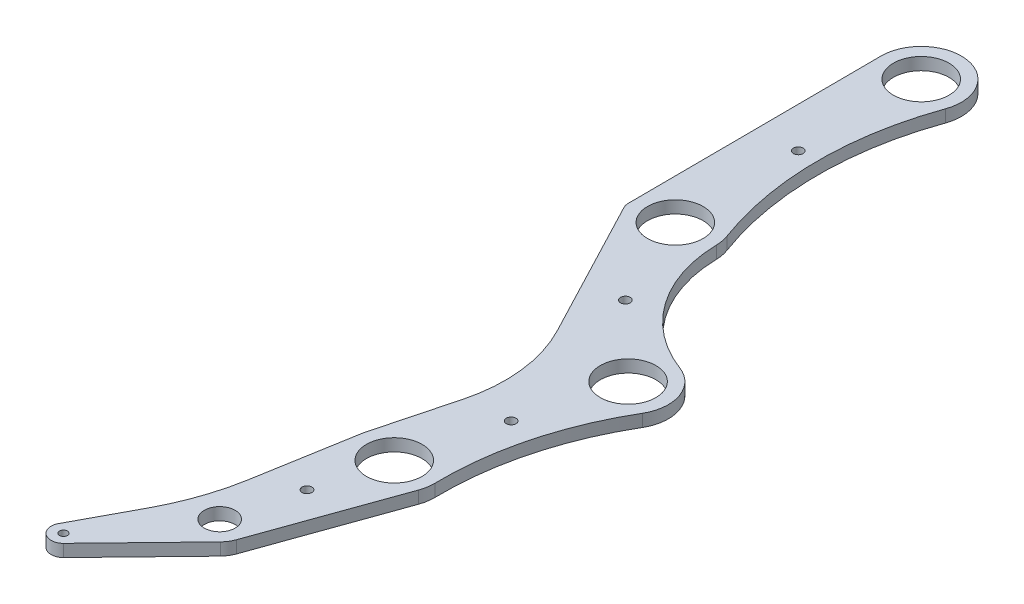
ISO-10303-21;
HEADER;
FILE_DESCRIPTION(('STEP AP214'),'2;1');
FILE_NAME('part.step','',(''),(''),'','','');
FILE_SCHEMA(('AUTOMOTIVE_DESIGN { 1 0 10303 214 1 1 1 1 }'));
ENDSEC;
DATA;
#1=APPLICATION_CONTEXT('core data for automotive mechanical design processes');
#2=APPLICATION_PROTOCOL_DEFINITION('international standard','automotive_design',2000,#1);
#3=PRODUCT_CONTEXT('',#1,'mechanical');
#4=PRODUCT('Part','Part','',(#3));
#5=PRODUCT_RELATED_PRODUCT_CATEGORY('part','',(#4));
#6=PRODUCT_DEFINITION_FORMATION('','',#4);
#7=PRODUCT_DEFINITION_CONTEXT('part definition',#1,'design');
#8=PRODUCT_DEFINITION('design','',#6,#7);
#9=PRODUCT_DEFINITION_SHAPE('','',#8);
#10=(LENGTH_UNIT() NAMED_UNIT(*) SI_UNIT(.MILLI.,.METRE.));
#11=(NAMED_UNIT(*) PLANE_ANGLE_UNIT() SI_UNIT($,.RADIAN.));
#12=(NAMED_UNIT(*) SI_UNIT($,.STERADIAN.) SOLID_ANGLE_UNIT());
#13=UNCERTAINTY_MEASURE_WITH_UNIT(LENGTH_MEASURE(1.E-05),#10,'distance_accuracy_value','');
#14=(GEOMETRIC_REPRESENTATION_CONTEXT(3) GLOBAL_UNCERTAINTY_ASSIGNED_CONTEXT((#13)) GLOBAL_UNIT_ASSIGNED_CONTEXT((#10,
#11,#12)) REPRESENTATION_CONTEXT('',''));
#15=CARTESIAN_POINT('',(0.,0.,0.));
#16=DIRECTION('',(0.,0.,1.));
#17=DIRECTION('',(1.,0.,0.));
#18=AXIS2_PLACEMENT_3D('',#15,#16,#17);
#19=CARTESIAN_POINT('',(-240.289810321256,3.175,-33.8542602698506));
#20=DIRECTION('',(0.,1.,0.));
#21=DIRECTION('',(0.,0.,1.));
#22=AXIS2_PLACEMENT_3D('',#19,#20,#21);
#23=PLANE('',#22);
#24=CARTESIAN_POINT('',(-98.1941762830271,3.175,-189.089496041911));
#25=DIRECTION('',(0.,1.,0.));
#26=DIRECTION('',(0.,0.,1.));
#27=AXIS2_PLACEMENT_3D('',#24,#25,#26);
#28=CIRCLE('',#27,2.48920000000002);
#29=CARTESIAN_POINT('',(-98.1941762830271,3.175,-186.600296041911));
#30=VERTEX_POINT('',#29);
#31=EDGE_CURVE('E363',#30,#30,#28,.T.);
#32=ORIENTED_EDGE('',*,*,#31,.F.);
#33=EDGE_LOOP('',(#32));
#34=FACE_BOUND('',#33,.T.);
#35=CARTESIAN_POINT('',(-95.6018276513845,3.175,-22.8217608302357));
#36=DIRECTION('',(0.,1.,0.));
#37=DIRECTION('',(0.,0.,1.));
#38=AXIS2_PLACEMENT_3D('',#35,#36,#37);
#39=CIRCLE('',#38,2.4892);
#40=CARTESIAN_POINT('',(-95.6018276513845,3.175,-20.3325608302357));
#41=VERTEX_POINT('',#40);
#42=EDGE_CURVE('E351',#41,#41,#39,.T.);
#43=ORIENTED_EDGE('',*,*,#42,.F.);
#44=EDGE_LOOP('',(#43));
#45=FACE_BOUND('',#44,.T.);
#46=CARTESIAN_POINT('',(-138.828241007033,3.175,59.1193454781708));
#47=DIRECTION('',(0.,1.,0.));
#48=DIRECTION('',(0.,0.,1.));
#49=AXIS2_PLACEMENT_3D('',#46,#47,#48);
#50=CIRCLE('',#49,2.02565000000002);
#51=CARTESIAN_POINT('',(-138.828241007033,3.175,61.1449954781708));
#52=VERTEX_POINT('',#51);
#53=EDGE_CURVE('E339',#52,#52,#50,.T.);
#54=ORIENTED_EDGE('',*,*,#53,.F.);
#55=EDGE_LOOP('',(#54));
#56=FACE_BOUND('',#55,.T.);
#57=CARTESIAN_POINT('',(-119.919675793583,3.175,-236.481615970642));
#58=DIRECTION('',(0.,1.,0.));
#59=DIRECTION('',(0.,0.,1.));
#60=AXIS2_PLACEMENT_3D('',#57,#58,#59);
#61=CIRCLE('',#60,14.2874999999999);
#62=CARTESIAN_POINT('',(-119.919675793583,3.175,-222.194115970642));
#63=VERTEX_POINT('',#62);
#64=EDGE_CURVE('E327',#63,#63,#61,.T.);
#65=ORIENTED_EDGE('',*,*,#64,.F.);
#66=EDGE_LOOP('',(#65));
#67=FACE_BOUND('',#66,.T.);
#68=CARTESIAN_POINT('',(-86.2657538413492,3.175,-58.3435216604715));
#69=DIRECTION('',(0.,1.,0.));
#70=DIRECTION('',(0.,0.,1.));
#71=AXIS2_PLACEMENT_3D('',#68,#69,#70);
#72=CIRCLE('',#71,14.2875);
#73=CARTESIAN_POINT('',(-86.2657538413492,3.175,-44.0560216604715));
#74=VERTEX_POINT('',#73);
#75=EDGE_CURVE('E285',#74,#74,#72,.T.);
#76=ORIENTED_EDGE('',*,*,#75,.F.);
#77=EDGE_LOOP('',(#76));
#78=FACE_BOUND('',#77,.T.);
#79=DIRECTION('',(0.00478524944495218,0.,0.999988550628331));
#80=VECTOR('',#79,1.);
#81=CARTESIAN_POINT('',(-141.164666186684,3.175,-363.38140631502));
#82=LINE('',#81,#80);
#83=CARTESIAN_POINT('',(-141.164666186684,3.175,-363.38140631502));
#84=VERTEX_POINT('',#83);
#85=CARTESIAN_POINT('',(-140.540290301718,3.175,-232.903623821849));
#86=VERTEX_POINT('',#85);
#87=EDGE_CURVE('E295',#84,#86,#82,.T.);
#88=ORIENTED_EDGE('',*,*,#87,.T.);
#89=CARTESIAN_POINT('',(-134.190363005228,3.175,-232.934010155824));
#90=DIRECTION('',(0.,1.,0.));
#91=DIRECTION('',(0.,0.,1.));
#92=AXIS2_PLACEMENT_3D('',#89,#90,#91);
#93=CIRCLE('',#92,6.35);
#94=CARTESIAN_POINT('',(-139.81536050136,3.175,-229.987503212253));
#95=VERTEX_POINT('',#94);
#96=EDGE_CURVE('E11',#86,#95,#93,.T.);
#97=ORIENTED_EDGE('',*,*,#96,.T.);
#98=DIRECTION('',(0.46401684150722,0.,0.885826377343587));
#99=VECTOR('',#98,1.);
#100=CARTESIAN_POINT('',(-140.532890654849,3.175,-231.357296460349));
#101=LINE('',#100,#99);
#102=CARTESIAN_POINT('',(-102.030793975978,3.175,-157.85528151108));
#103=VERTEX_POINT('',#102);
#104=EDGE_CURVE('E293',#95,#103,#101,.T.);
#105=ORIENTED_EDGE('',*,*,#104,.T.);
#106=CARTESIAN_POINT('',(-169.53076392956,3.175,-122.49719818823));
#107=DIRECTION('',(0.,-1.,0.));
#108=DIRECTION('',(0.,0.,1.));
#109=AXIS2_PLACEMENT_3D('',#106,#107,#108);
#110=CIRCLE('',#109,76.2);
#111=CARTESIAN_POINT('',(-95.8336839373852,3.175,-103.127624093092));
#112=VERTEX_POINT('',#111);
#113=EDGE_CURVE('E291',#103,#112,#110,.T.);
#114=ORIENTED_EDGE('',*,*,#113,.T.);
#115=DIRECTION('',(-0.254193885762964,0.,0.967153280737198));
#116=VECTOR('',#115,1.);
#117=CARTESIAN_POINT('',(-95.8336839373852,3.175,-103.127624093092));
#118=LINE('',#117,#116);
#119=CARTESIAN_POINT('',(-106.225379672563,3.175,-63.5894479779046));
#120=VERTEX_POINT('',#119);
#121=EDGE_CURVE('E289',#112,#120,#118,.T.);
#122=ORIENTED_EDGE('',*,*,#121,.T.);
#123=CARTESIAN_POINT('',(-86.2657538413492,3.175,-58.3435216604715));
#124=DIRECTION('',(0.,1.,0.));
#125=DIRECTION('',(0.,0.,1.));
#126=AXIS2_PLACEMENT_3D('',#123,#124,#125);
#127=CIRCLE('',#126,20.6375);
#128=CARTESIAN_POINT('',(-106.604150669537,3.175,-61.8443816561251));
#129=VERTEX_POINT('',#128);
#130=EDGE_CURVE('E287',#120,#129,#127,.T.);
#131=ORIENTED_EDGE('',*,*,#130,.T.);
#132=DIRECTION('',(-0.169635856845723,0.,0.985506811783773));
#133=VECTOR('',#132,1.);
#134=CARTESIAN_POINT('',(-106.604150669537,3.175,-61.8443816561251));
#135=LINE('',#134,#133);
#136=CARTESIAN_POINT('',(-115.130445224717,3.175,-12.3105064504438));
#137=VERTEX_POINT('',#136);
#138=EDGE_CURVE('E186',#129,#137,#135,.T.);
#139=ORIENTED_EDGE('',*,*,#138,.T.);
#140=CARTESIAN_POINT('',(-240.289810321256,3.175,-33.8542602698506));
#141=DIRECTION('',(0.,-1.,0.));
#142=DIRECTION('',(0.,0.,1.));
#143=AXIS2_PLACEMENT_3D('',#140,#141,#142);
#144=CIRCLE('',#143,127.);
#145=CARTESIAN_POINT('',(-128.358659431652,3.175,26.1492184670419));
#146=VERTEX_POINT('',#145);
#147=EDGE_CURVE('E181',#137,#146,#144,.T.);
#148=ORIENTED_EDGE('',*,*,#147,.T.);
#149=DIRECTION('',(-0.472468336510965,0.,0.881347644800031));
#150=VECTOR('',#149,1.);
#151=CARTESIAN_POINT('',(-128.358659431652,3.175,26.1492184670419));
#152=LINE('',#151,#150);
#153=CARTESIAN_POINT('',(-144.424798551513,3.175,56.1191715413262));
#154=VERTEX_POINT('',#153);
#155=EDGE_CURVE('E170',#146,#154,#152,.T.);
#156=ORIENTED_EDGE('',*,*,#155,.T.);
#157=CARTESIAN_POINT('',(-138.828241007033,3.175,59.1193454781708));
#158=DIRECTION('',(0.,1.,0.));
#159=DIRECTION('',(0.,0.,1.));
#160=AXIS2_PLACEMENT_3D('',#157,#158,#159);
#161=CIRCLE('',#160,6.35000000000002);
#162=CARTESIAN_POINT('',(-134.265905883713,3.175,63.5360861568301));
#163=VERTEX_POINT('',#162);
#164=EDGE_CURVE('E180',#154,#163,#161,.T.);
#165=ORIENTED_EDGE('',*,*,#164,.T.);
#166=DIRECTION('',(0.695549713174696,0.,-0.718477972176321));
#167=VECTOR('',#166,1.);
#168=CARTESIAN_POINT('',(-134.265905883713,3.175,63.5360861568301));
#169=LINE('',#168,#167);
#170=CARTESIAN_POINT('',(-94.6726474339506,3.175,22.6376665269835));
#171=VERTEX_POINT('',#170);
#172=EDGE_CURVE('E315',#163,#171,#169,.T.);
#173=ORIENTED_EDGE('',*,*,#172,.T.);
#174=CARTESIAN_POINT('',(-104.93790146142,3.175,12.7));
#175=DIRECTION('',(0.,1.,0.));
#176=DIRECTION('',(0.,0.,1.));
#177=AXIS2_PLACEMENT_3D('',#174,#175,#176);
#178=CIRCLE('',#177,14.2875);
#179=CARTESIAN_POINT('',(-91.4853807087424,3.175,17.5127270490632));
#180=VERTEX_POINT('',#179);
#181=EDGE_CURVE('E313',#171,#180,#178,.T.);
#182=ORIENTED_EDGE('',*,*,#181,.T.);
#183=DIRECTION('',(0.336848787336004,0.,-0.941558757842687));
#184=VECTOR('',#183,1.);
#185=CARTESIAN_POINT('',(-91.4853807087424,3.175,17.5127270490632));
#186=LINE('',#185,#184);
#187=CARTESIAN_POINT('',(-66.8343349763708,3.175,-51.3918048118247));
#188=VERTEX_POINT('',#187);
#189=EDGE_CURVE('E311',#180,#188,#186,.T.);
#190=ORIENTED_EDGE('',*,*,#189,.T.);
#191=CARTESIAN_POINT('',(-86.2657538413492,3.175,-58.3435216604715));
#192=DIRECTION('',(0.,1.,0.));
#193=DIRECTION('',(0.,0.,1.));
#194=AXIS2_PLACEMENT_3D('',#191,#192,#193);
#195=CIRCLE('',#194,20.6375);
#196=CARTESIAN_POINT('',(-65.63190809458,3.175,-58.7318719514898));
#197=VERTEX_POINT('',#196);
#198=EDGE_CURVE('E309',#188,#197,#195,.T.);
#199=ORIENTED_EDGE('',*,*,#198,.T.);
#200=CARTESIAN_POINT('',(94.3990569875279,3.175,-61.7438200209033));
#201=DIRECTION('',(0.,-1.,0.));
#202=DIRECTION('',(0.,0.,1.));
#203=AXIS2_PLACEMENT_3D('',#200,#201,#202);
#204=CIRCLE('',#203,160.059306559424);
#205=CARTESIAN_POINT('',(-43.4703149705874,3.175,-143.051986229215));
#206=VERTEX_POINT('',#205);
#207=EDGE_CURVE('E307',#197,#206,#204,.T.);
#208=ORIENTED_EDGE('',*,*,#207,.T.);
#209=CARTESIAN_POINT('',(-61.2467206351295,3.175,-153.53558331703));
#210=DIRECTION('',(0.,1.,0.));
#211=DIRECTION('',(0.,0.,1.));
#212=AXIS2_PLACEMENT_3D('',#209,#210,#211);
#213=CIRCLE('',#212,20.6374999999999);
#214=CARTESIAN_POINT('',(-53.9947234829265,3.175,-172.856943092016));
#215=VERTEX_POINT('',#214);
#216=EDGE_CURVE('E305',#206,#215,#213,.T.);
#217=ORIENTED_EDGE('',*,*,#216,.T.);
#218=CARTESIAN_POINT('',(-29.4495023523931,3.175,-238.252314638122));
#219=DIRECTION('',(0.,-1.,0.));
#220=DIRECTION('',(0.,0.,1.));
#221=AXIS2_PLACEMENT_3D('',#218,#219,#220);
#222=CIRCLE('',#221,69.85);
#223=CARTESIAN_POINT('',(-99.2861274648905,3.175,-236.885459526383));
#224=VERTEX_POINT('',#223);
#225=EDGE_CURVE('E303',#215,#224,#222,.T.);
#226=ORIENTED_EDGE('',*,*,#225,.T.);
#227=CARTESIAN_POINT('',(-119.919675793583,3.175,-236.481615970642));
#228=DIRECTION('',(0.,1.,0.));
#229=DIRECTION('',(0.,0.,1.));
#230=AXIS2_PLACEMENT_3D('',#227,#228,#229);
#231=CIRCLE('',#230,20.6375);
#232=CARTESIAN_POINT('',(-100.559704107501,3.175,-243.629895663274));
#233=VERTEX_POINT('',#232);
#234=EDGE_CURVE('E301',#224,#233,#231,.T.);
#235=ORIENTED_EDGE('',*,*,#234,.T.);
#236=CARTESIAN_POINT('',(54.3200693811581,3.175,-300.816133204327));
#237=DIRECTION('',(0.,-1.,0.));
#238=DIRECTION('',(0.,0.,1.));
#239=AXIS2_PLACEMENT_3D('',#236,#237,#238);
#240=CIRCLE('',#239,165.1);
#241=CARTESIAN_POINT('',(-101.099905600397,3.175,-356.517492045317));
#242=VERTEX_POINT('',#241);
#243=EDGE_CURVE('E299',#233,#242,#240,.T.);
#244=ORIENTED_EDGE('',*,*,#243,.T.);
#245=CARTESIAN_POINT('',(-120.527402473092,3.175,-363.48016190044));
#246=DIRECTION('',(0.,1.,0.));
#247=DIRECTION('',(0.,0.,1.));
#248=AXIS2_PLACEMENT_3D('',#245,#246,#247);
#249=CIRCLE('',#248,20.6375);
#250=EDGE_CURVE('E297',#242,#84,#249,.T.);
#251=ORIENTED_EDGE('',*,*,#250,.T.);
#252=EDGE_LOOP('',(#88,#97,#105,#114,#122,#131,#139,#148,#156,#165,#173,#182,#190,#199,#208,
#217,#226,#235,#244,#251));
#253=FACE_BOUND('',#252,.T.);
#254=CARTESIAN_POINT('',(-61.2467206351295,3.175,-153.53558331703));
#255=DIRECTION('',(0.,1.,0.));
#256=DIRECTION('',(0.,0.,1.));
#257=AXIS2_PLACEMENT_3D('',#254,#255,#256);
#258=CIRCLE('',#257,14.2875);
#259=CARTESIAN_POINT('',(-61.2467206351295,3.175,-139.24808331703));
#260=VERTEX_POINT('',#259);
#261=EDGE_CURVE('E321',#260,#260,#258,.T.);
#262=ORIENTED_EDGE('',*,*,#261,.F.);
#263=EDGE_LOOP('',(#262));
#264=FACE_BOUND('',#263,.T.);
#265=CARTESIAN_POINT('',(-120.527402473092,3.175,-363.48016190044));
#266=DIRECTION('',(0.,1.,0.));
#267=DIRECTION('',(0.,0.,1.));
#268=AXIS2_PLACEMENT_3D('',#265,#266,#267);
#269=CIRCLE('',#268,14.2875);
#270=CARTESIAN_POINT('',(-120.527402473092,3.175,-349.19266190044));
#271=VERTEX_POINT('',#270);
#272=EDGE_CURVE('E333',#271,#271,#269,.T.);
#273=ORIENTED_EDGE('',*,*,#272,.F.);
#274=EDGE_LOOP('',(#273));
#275=FACE_BOUND('',#274,.T.);
#276=CARTESIAN_POINT('',(-104.93790146142,3.175,12.7));
#277=DIRECTION('',(0.,1.,0.));
#278=DIRECTION('',(0.,0.,1.));
#279=AXIS2_PLACEMENT_3D('',#276,#277,#278);
#280=CIRCLE('',#279,7.93749999999999);
#281=CARTESIAN_POINT('',(-104.93790146142,3.175,20.6375));
#282=VERTEX_POINT('',#281);
#283=EDGE_CURVE('E345',#282,#282,#280,.T.);
#284=ORIENTED_EDGE('',*,*,#283,.F.);
#285=EDGE_LOOP('',(#284));
#286=FACE_BOUND('',#285,.T.);
#287=CARTESIAN_POINT('',(-73.7562372382393,3.175,-105.939552488751));
#288=DIRECTION('',(0.,1.,0.));
#289=DIRECTION('',(0.,0.,1.));
#290=AXIS2_PLACEMENT_3D('',#287,#288,#289);
#291=CIRCLE('',#290,2.4892);
#292=CARTESIAN_POINT('',(-73.7562372382393,3.175,-103.450352488751));
#293=VERTEX_POINT('',#292);
#294=EDGE_CURVE('E357',#293,#293,#291,.T.);
#295=ORIENTED_EDGE('',*,*,#294,.F.);
#296=EDGE_LOOP('',(#295));
#297=FACE_BOUND('',#296,.T.);
#298=CARTESIAN_POINT('',(-120.223539133337,3.175,-299.980888935541));
#299=DIRECTION('',(0.,1.,0.));
#300=DIRECTION('',(0.,0.,1.));
#301=AXIS2_PLACEMENT_3D('',#298,#299,#300);
#302=CIRCLE('',#301,2.48920000000001);
#303=CARTESIAN_POINT('',(-120.223539133337,3.175,-297.491688935541));
#304=VERTEX_POINT('',#303);
#305=EDGE_CURVE('E369',#304,#304,#302,.T.);
#306=ORIENTED_EDGE('',*,*,#305,.F.);
#307=EDGE_LOOP('',(#306));
#308=FACE_BOUND('',#307,.T.);
#309=ADVANCED_FACE('F33',(#34,#45,#56,#67,#78,#253,#264,#275,#286,#297,#308),#23,.T.);
#310=CARTESIAN_POINT('',(-240.289810321256,-3.175,-33.8542602698506));
#311=DIRECTION('',(0.,1.,0.));
#312=DIRECTION('',(0.,0.,1.));
#313=AXIS2_PLACEMENT_3D('',#310,#311,#312);
#314=PLANE('',#313);
#315=DIRECTION('',(0.46401684150722,0.,0.885826377343587));
#316=VECTOR('',#315,1.);
#317=CARTESIAN_POINT('',(-140.532890654849,-3.175,-231.357296460349));
#318=LINE('',#317,#316);
#319=CARTESIAN_POINT('',(-139.81536050136,-3.175,-229.987503212253));
#320=VERTEX_POINT('',#319);
#321=CARTESIAN_POINT('',(-102.030793975978,-3.175,-157.85528151108));
#322=VERTEX_POINT('',#321);
#323=EDGE_CURVE('E256',#320,#322,#318,.T.);
#324=ORIENTED_EDGE('',*,*,#323,.F.);
#325=CARTESIAN_POINT('',(-134.190363005228,-3.175,-232.934010155824));
#326=DIRECTION('',(0.,1.,0.));
#327=DIRECTION('',(0.,0.,1.));
#328=AXIS2_PLACEMENT_3D('',#325,#326,#327);
#329=CIRCLE('',#328,6.35);
#330=CARTESIAN_POINT('',(-140.540290301718,-3.175,-232.903623821849));
#331=VERTEX_POINT('',#330);
#332=EDGE_CURVE('E55',#320,#331,#329,.F.);
#333=ORIENTED_EDGE('',*,*,#332,.T.);
#334=DIRECTION('',(0.00478524944495218,0.,0.999988550628331));
#335=VECTOR('',#334,1.);
#336=CARTESIAN_POINT('',(-141.164666186684,-3.175,-363.38140631502));
#337=LINE('',#336,#335);
#338=CARTESIAN_POINT('',(-141.164666186684,-3.175,-363.38140631502));
#339=VERTEX_POINT('',#338);
#340=EDGE_CURVE('E258',#339,#331,#337,.T.);
#341=ORIENTED_EDGE('',*,*,#340,.F.);
#342=CARTESIAN_POINT('',(-120.527402473092,-3.175,-363.48016190044));
#343=DIRECTION('',(0.,1.,0.));
#344=DIRECTION('',(0.,0.,1.));
#345=AXIS2_PLACEMENT_3D('',#342,#343,#344);
#346=CIRCLE('',#345,20.6375);
#347=CARTESIAN_POINT('',(-101.099905600397,-3.175,-356.517492045317));
#348=VERTEX_POINT('',#347);
#349=EDGE_CURVE('E260',#348,#339,#346,.T.);
#350=ORIENTED_EDGE('',*,*,#349,.F.);
#351=CARTESIAN_POINT('',(54.3200693811581,-3.175,-300.816133204327));
#352=DIRECTION('',(0.,-1.,0.));
#353=DIRECTION('',(0.,0.,1.));
#354=AXIS2_PLACEMENT_3D('',#351,#352,#353);
#355=CIRCLE('',#354,165.1);
#356=CARTESIAN_POINT('',(-100.559704107501,-3.175,-243.629895663274));
#357=VERTEX_POINT('',#356);
#358=EDGE_CURVE('E262',#357,#348,#355,.T.);
#359=ORIENTED_EDGE('',*,*,#358,.F.);
#360=CARTESIAN_POINT('',(-119.919675793583,-3.175,-236.481615970642));
#361=DIRECTION('',(0.,1.,0.));
#362=DIRECTION('',(0.,0.,1.));
#363=AXIS2_PLACEMENT_3D('',#360,#361,#362);
#364=CIRCLE('',#363,20.6375);
#365=CARTESIAN_POINT('',(-99.2861274648905,-3.175,-236.885459526383));
#366=VERTEX_POINT('',#365);
#367=EDGE_CURVE('E264',#366,#357,#364,.T.);
#368=ORIENTED_EDGE('',*,*,#367,.F.);
#369=CARTESIAN_POINT('',(-29.4495023523931,-3.175,-238.252314638122));
#370=DIRECTION('',(0.,-1.,0.));
#371=DIRECTION('',(0.,0.,1.));
#372=AXIS2_PLACEMENT_3D('',#369,#370,#371);
#373=CIRCLE('',#372,69.85);
#374=CARTESIAN_POINT('',(-53.9947234829265,-3.175,-172.856943092016));
#375=VERTEX_POINT('',#374);
#376=EDGE_CURVE('E266',#375,#366,#373,.T.);
#377=ORIENTED_EDGE('',*,*,#376,.F.);
#378=CARTESIAN_POINT('',(-61.2467206351295,-3.175,-153.53558331703));
#379=DIRECTION('',(0.,1.,0.));
#380=DIRECTION('',(0.,0.,1.));
#381=AXIS2_PLACEMENT_3D('',#378,#379,#380);
#382=CIRCLE('',#381,20.6374999999999);
#383=CARTESIAN_POINT('',(-43.4703149705874,-3.175,-143.051986229215));
#384=VERTEX_POINT('',#383);
#385=EDGE_CURVE('E268',#384,#375,#382,.T.);
#386=ORIENTED_EDGE('',*,*,#385,.F.);
#387=CARTESIAN_POINT('',(94.3990569875279,-3.175,-61.7438200209033));
#388=DIRECTION('',(0.,-1.,0.));
#389=DIRECTION('',(0.,0.,1.));
#390=AXIS2_PLACEMENT_3D('',#387,#388,#389);
#391=CIRCLE('',#390,160.059306559424);
#392=CARTESIAN_POINT('',(-65.63190809458,-3.175,-58.7318719514898));
#393=VERTEX_POINT('',#392);
#394=EDGE_CURVE('E270',#393,#384,#391,.T.);
#395=ORIENTED_EDGE('',*,*,#394,.F.);
#396=CARTESIAN_POINT('',(-86.2657538413492,-3.175,-58.3435216604715));
#397=DIRECTION('',(0.,1.,0.));
#398=DIRECTION('',(0.,0.,1.));
#399=AXIS2_PLACEMENT_3D('',#396,#397,#398);
#400=CIRCLE('',#399,20.6375);
#401=CARTESIAN_POINT('',(-66.8343349763708,-3.175,-51.3918048118247));
#402=VERTEX_POINT('',#401);
#403=EDGE_CURVE('E272',#402,#393,#400,.T.);
#404=ORIENTED_EDGE('',*,*,#403,.F.);
#405=DIRECTION('',(0.336848787336004,0.,-0.941558757842687));
#406=VECTOR('',#405,1.);
#407=CARTESIAN_POINT('',(-91.4853807087424,-3.175,17.5127270490632));
#408=LINE('',#407,#406);
#409=CARTESIAN_POINT('',(-91.4853807087424,-3.175,17.5127270490632));
#410=VERTEX_POINT('',#409);
#411=EDGE_CURVE('E274',#410,#402,#408,.T.);
#412=ORIENTED_EDGE('',*,*,#411,.F.);
#413=CARTESIAN_POINT('',(-104.93790146142,-3.175,12.7));
#414=DIRECTION('',(0.,1.,0.));
#415=DIRECTION('',(0.,0.,1.));
#416=AXIS2_PLACEMENT_3D('',#413,#414,#415);
#417=CIRCLE('',#416,14.2875);
#418=CARTESIAN_POINT('',(-94.6726474339506,-3.175,22.6376665269835));
#419=VERTEX_POINT('',#418);
#420=EDGE_CURVE('E276',#419,#410,#417,.T.);
#421=ORIENTED_EDGE('',*,*,#420,.F.);
#422=DIRECTION('',(0.695549713174696,0.,-0.718477972176321));
#423=VECTOR('',#422,1.);
#424=CARTESIAN_POINT('',(-134.265905883713,-3.175,63.5360861568301));
#425=LINE('',#424,#423);
#426=CARTESIAN_POINT('',(-134.265905883713,-3.175,63.5360861568301));
#427=VERTEX_POINT('',#426);
#428=EDGE_CURVE('E278',#427,#419,#425,.T.);
#429=ORIENTED_EDGE('',*,*,#428,.F.);
#430=CARTESIAN_POINT('',(-138.828241007033,-3.175,59.1193454781708));
#431=DIRECTION('',(0.,1.,0.));
#432=DIRECTION('',(0.,0.,1.));
#433=AXIS2_PLACEMENT_3D('',#430,#431,#432);
#434=CIRCLE('',#433,6.35000000000002);
#435=CARTESIAN_POINT('',(-144.424798551513,-3.175,56.1191715413262));
#436=VERTEX_POINT('',#435);
#437=EDGE_CURVE('E280',#436,#427,#434,.T.);
#438=ORIENTED_EDGE('',*,*,#437,.F.);
#439=DIRECTION('',(-0.472468336510965,0.,0.881347644800031));
#440=VECTOR('',#439,1.);
#441=CARTESIAN_POINT('',(-128.358659431652,-3.175,26.1492184670419));
#442=LINE('',#441,#440);
#443=CARTESIAN_POINT('',(-128.358659431652,-3.175,26.1492184670419));
#444=VERTEX_POINT('',#443);
#445=EDGE_CURVE('E282',#444,#436,#442,.T.);
#446=ORIENTED_EDGE('',*,*,#445,.F.);
#447=CARTESIAN_POINT('',(-240.289810321256,-3.175,-33.8542602698506));
#448=DIRECTION('',(0.,-1.,0.));
#449=DIRECTION('',(0.,0.,1.));
#450=AXIS2_PLACEMENT_3D('',#447,#448,#449);
#451=CIRCLE('',#450,127.);
#452=CARTESIAN_POINT('',(-115.130445224717,-3.175,-12.3105064504438));
#453=VERTEX_POINT('',#452);
#454=EDGE_CURVE('E194',#453,#444,#451,.T.);
#455=ORIENTED_EDGE('',*,*,#454,.F.);
#456=DIRECTION('',(-0.169635856845723,0.,0.985506811783773));
#457=VECTOR('',#456,1.);
#458=CARTESIAN_POINT('',(-106.604150669537,-3.175,-61.8443816561251));
#459=LINE('',#458,#457);
#460=CARTESIAN_POINT('',(-106.604150669537,-3.175,-61.8443816561251));
#461=VERTEX_POINT('',#460);
#462=EDGE_CURVE('E190',#461,#453,#459,.T.);
#463=ORIENTED_EDGE('',*,*,#462,.F.);
#464=CARTESIAN_POINT('',(-86.2657538413492,-3.175,-58.3435216604715));
#465=DIRECTION('',(0.,1.,0.));
#466=DIRECTION('',(0.,0.,1.));
#467=AXIS2_PLACEMENT_3D('',#464,#465,#466);
#468=CIRCLE('',#467,20.6375);
#469=CARTESIAN_POINT('',(-106.225379672563,-3.175,-63.5894479779046));
#470=VERTEX_POINT('',#469);
#471=EDGE_CURVE('E250',#470,#461,#468,.T.);
#472=ORIENTED_EDGE('',*,*,#471,.F.);
#473=DIRECTION('',(-0.254193885762964,0.,0.967153280737198));
#474=VECTOR('',#473,1.);
#475=CARTESIAN_POINT('',(-95.8336839373852,-3.175,-103.127624093092));
#476=LINE('',#475,#474);
#477=CARTESIAN_POINT('',(-95.8336839373852,-3.175,-103.127624093092));
#478=VERTEX_POINT('',#477);
#479=EDGE_CURVE('E252',#478,#470,#476,.T.);
#480=ORIENTED_EDGE('',*,*,#479,.F.);
#481=CARTESIAN_POINT('',(-169.53076392956,-3.175,-122.49719818823));
#482=DIRECTION('',(0.,-1.,0.));
#483=DIRECTION('',(0.,0.,1.));
#484=AXIS2_PLACEMENT_3D('',#481,#482,#483);
#485=CIRCLE('',#484,76.2);
#486=EDGE_CURVE('E254',#322,#478,#485,.T.);
#487=ORIENTED_EDGE('',*,*,#486,.F.);
#488=EDGE_LOOP('',(#324,#333,#341,#350,#359,#368,#377,#386,#395,#404,#412,#421,#429,#438,#446,
#455,#463,#472,#480,#487));
#489=FACE_BOUND('',#488,.T.);
#490=CARTESIAN_POINT('',(-86.2657538413492,-3.175,-58.3435216604715));
#491=DIRECTION('',(0.,1.,0.));
#492=DIRECTION('',(0.,0.,1.));
#493=AXIS2_PLACEMENT_3D('',#490,#491,#492);
#494=CIRCLE('',#493,14.2875);
#495=CARTESIAN_POINT('',(-86.2657538413492,-3.175,-44.0560216604715));
#496=VERTEX_POINT('',#495);
#497=EDGE_CURVE('E318',#496,#496,#494,.T.);
#498=ORIENTED_EDGE('',*,*,#497,.T.);
#499=EDGE_LOOP('',(#498));
#500=FACE_BOUND('',#499,.T.);
#501=CARTESIAN_POINT('',(-61.2467206351295,-3.175,-153.53558331703));
#502=DIRECTION('',(0.,1.,0.));
#503=DIRECTION('',(0.,0.,1.));
#504=AXIS2_PLACEMENT_3D('',#501,#502,#503);
#505=CIRCLE('',#504,14.2875);
#506=CARTESIAN_POINT('',(-61.2467206351295,-3.175,-139.24808331703));
#507=VERTEX_POINT('',#506);
#508=EDGE_CURVE('E324',#507,#507,#505,.T.);
#509=ORIENTED_EDGE('',*,*,#508,.T.);
#510=EDGE_LOOP('',(#509));
#511=FACE_BOUND('',#510,.T.);
#512=CARTESIAN_POINT('',(-119.919675793583,-3.175,-236.481615970642));
#513=DIRECTION('',(0.,1.,0.));
#514=DIRECTION('',(0.,0.,1.));
#515=AXIS2_PLACEMENT_3D('',#512,#513,#514);
#516=CIRCLE('',#515,14.2874999999999);
#517=CARTESIAN_POINT('',(-119.919675793583,-3.175,-222.194115970642));
#518=VERTEX_POINT('',#517);
#519=EDGE_CURVE('E330',#518,#518,#516,.T.);
#520=ORIENTED_EDGE('',*,*,#519,.T.);
#521=EDGE_LOOP('',(#520));
#522=FACE_BOUND('',#521,.T.);
#523=CARTESIAN_POINT('',(-120.527402473092,-3.175,-363.48016190044));
#524=DIRECTION('',(0.,1.,0.));
#525=DIRECTION('',(0.,0.,1.));
#526=AXIS2_PLACEMENT_3D('',#523,#524,#525);
#527=CIRCLE('',#526,14.2875);
#528=CARTESIAN_POINT('',(-120.527402473092,-3.175,-349.19266190044));
#529=VERTEX_POINT('',#528);
#530=EDGE_CURVE('E336',#529,#529,#527,.T.);
#531=ORIENTED_EDGE('',*,*,#530,.T.);
#532=EDGE_LOOP('',(#531));
#533=FACE_BOUND('',#532,.T.);
#534=CARTESIAN_POINT('',(-138.828241007033,-3.175,59.1193454781708));
#535=DIRECTION('',(0.,1.,0.));
#536=DIRECTION('',(0.,0.,1.));
#537=AXIS2_PLACEMENT_3D('',#534,#535,#536);
#538=CIRCLE('',#537,2.02565000000002);
#539=CARTESIAN_POINT('',(-138.828241007033,-3.175,61.1449954781708));
#540=VERTEX_POINT('',#539);
#541=EDGE_CURVE('E342',#540,#540,#538,.T.);
#542=ORIENTED_EDGE('',*,*,#541,.T.);
#543=EDGE_LOOP('',(#542));
#544=FACE_BOUND('',#543,.T.);
#545=CARTESIAN_POINT('',(-104.93790146142,-3.175,12.7));
#546=DIRECTION('',(0.,1.,0.));
#547=DIRECTION('',(0.,0.,1.));
#548=AXIS2_PLACEMENT_3D('',#545,#546,#547);
#549=CIRCLE('',#548,7.93749999999999);
#550=CARTESIAN_POINT('',(-104.93790146142,-3.175,20.6375));
#551=VERTEX_POINT('',#550);
#552=EDGE_CURVE('E348',#551,#551,#549,.T.);
#553=ORIENTED_EDGE('',*,*,#552,.T.);
#554=EDGE_LOOP('',(#553));
#555=FACE_BOUND('',#554,.T.);
#556=CARTESIAN_POINT('',(-95.6018276513845,-3.175,-22.8217608302357));
#557=DIRECTION('',(0.,1.,0.));
#558=DIRECTION('',(0.,0.,1.));
#559=AXIS2_PLACEMENT_3D('',#556,#557,#558);
#560=CIRCLE('',#559,2.4892);
#561=CARTESIAN_POINT('',(-95.6018276513845,-3.175,-20.3325608302357));
#562=VERTEX_POINT('',#561);
#563=EDGE_CURVE('E354',#562,#562,#560,.T.);
#564=ORIENTED_EDGE('',*,*,#563,.T.);
#565=EDGE_LOOP('',(#564));
#566=FACE_BOUND('',#565,.T.);
#567=CARTESIAN_POINT('',(-73.7562372382393,-3.175,-105.939552488751));
#568=DIRECTION('',(0.,1.,0.));
#569=DIRECTION('',(0.,0.,1.));
#570=AXIS2_PLACEMENT_3D('',#567,#568,#569);
#571=CIRCLE('',#570,2.4892);
#572=CARTESIAN_POINT('',(-73.7562372382393,-3.175,-103.450352488751));
#573=VERTEX_POINT('',#572);
#574=EDGE_CURVE('E360',#573,#573,#571,.T.);
#575=ORIENTED_EDGE('',*,*,#574,.T.);
#576=EDGE_LOOP('',(#575));
#577=FACE_BOUND('',#576,.T.);
#578=CARTESIAN_POINT('',(-98.1941762830271,-3.175,-189.089496041911));
#579=DIRECTION('',(0.,1.,0.));
#580=DIRECTION('',(0.,0.,1.));
#581=AXIS2_PLACEMENT_3D('',#578,#579,#580);
#582=CIRCLE('',#581,2.48920000000002);
#583=CARTESIAN_POINT('',(-98.1941762830271,-3.175,-186.600296041911));
#584=VERTEX_POINT('',#583);
#585=EDGE_CURVE('E366',#584,#584,#582,.T.);
#586=ORIENTED_EDGE('',*,*,#585,.T.);
#587=EDGE_LOOP('',(#586));
#588=FACE_BOUND('',#587,.T.);
#589=CARTESIAN_POINT('',(-120.223539133337,-3.175,-299.980888935541));
#590=DIRECTION('',(0.,1.,0.));
#591=DIRECTION('',(0.,0.,1.));
#592=AXIS2_PLACEMENT_3D('',#589,#590,#591);
#593=CIRCLE('',#592,2.48920000000001);
#594=CARTESIAN_POINT('',(-120.223539133337,-3.175,-297.491688935541));
#595=VERTEX_POINT('',#594);
#596=EDGE_CURVE('E372',#595,#595,#593,.T.);
#597=ORIENTED_EDGE('',*,*,#596,.T.);
#598=EDGE_LOOP('',(#597));
#599=FACE_BOUND('',#598,.T.);
#600=ADVANCED_FACE('F382',(#489,#500,#511,#522,#533,#544,#555,#566,#577,#588,#599),#314,.F.);
#601=CARTESIAN_POINT('',(-240.289810321256,3.175,-33.8542602698506));
#602=DIRECTION('',(0.,-1.,0.));
#603=DIRECTION('',(0.,0.,-1.));
#604=AXIS2_PLACEMENT_3D('',#601,#602,#603);
#605=CYLINDRICAL_SURFACE('',#604,127.);
#606=ORIENTED_EDGE('',*,*,#454,.T.);
#607=DIRECTION('',(0.,-1.,0.));
#608=VECTOR('',#607,1.);
#609=CARTESIAN_POINT('',(-128.358659431652,3.175,26.1492184670419));
#610=LINE('',#609,#608);
#611=EDGE_CURVE('E174',#146,#444,#610,.T.);
#612=ORIENTED_EDGE('',*,*,#611,.F.);
#613=ORIENTED_EDGE('',*,*,#147,.F.);
#614=DIRECTION('',(0.,-1.,0.));
#615=VECTOR('',#614,1.);
#616=CARTESIAN_POINT('',(-115.130445224717,3.175,-12.3105064504438));
#617=LINE('',#616,#615);
#618=EDGE_CURVE('E247',#137,#453,#617,.T.);
#619=ORIENTED_EDGE('',*,*,#618,.T.);
#620=EDGE_LOOP('',(#606,#612,#613,#619));
#621=FACE_BOUND('',#620,.T.);
#622=ADVANCED_FACE('F192',(#621),#605,.F.);
#623=CARTESIAN_POINT('',(-128.358659431652,3.175,26.1492184670419));
#624=DIRECTION('',(0.881347644800031,0.,0.472468336510965));
#625=DIRECTION('',(0.472468336510965,0.,-0.881347644800031));
#626=AXIS2_PLACEMENT_3D('',#623,#624,#625);
#627=PLANE('',#626);
#628=ORIENTED_EDGE('',*,*,#445,.T.);
#629=DIRECTION('',(0.,-1.,0.));
#630=VECTOR('',#629,1.);
#631=CARTESIAN_POINT('',(-144.424798551513,3.175,56.1191715413262));
#632=LINE('',#631,#630);
#633=EDGE_CURVE('E177',#154,#436,#632,.T.);
#634=ORIENTED_EDGE('',*,*,#633,.F.);
#635=ORIENTED_EDGE('',*,*,#155,.F.);
#636=ORIENTED_EDGE('',*,*,#611,.T.);
#637=EDGE_LOOP('',(#628,#634,#635,#636));
#638=FACE_BOUND('',#637,.T.);
#639=ADVANCED_FACE('F172',(#638),#627,.F.);
#640=CARTESIAN_POINT('',(-138.828241007033,3.175,59.1193454781708));
#641=DIRECTION('',(0.,-1.,0.));
#642=DIRECTION('',(0.,0.,-1.));
#643=AXIS2_PLACEMENT_3D('',#640,#641,#642);
#644=CYLINDRICAL_SURFACE('',#643,6.35000000000002);
#645=ORIENTED_EDGE('',*,*,#437,.T.);
#646=DIRECTION('',(0.,-1.,0.));
#647=VECTOR('',#646,1.);
#648=CARTESIAN_POINT('',(-134.265905883713,3.175,63.5360861568301));
#649=LINE('',#648,#647);
#650=EDGE_CURVE('E199',#163,#427,#649,.T.);
#651=ORIENTED_EDGE('',*,*,#650,.F.);
#652=ORIENTED_EDGE('',*,*,#164,.F.);
#653=ORIENTED_EDGE('',*,*,#633,.T.);
#654=EDGE_LOOP('',(#645,#651,#652,#653));
#655=FACE_BOUND('',#654,.T.);
#656=ADVANCED_FACE('F457',(#655),#644,.T.);
#657=CARTESIAN_POINT('',(-134.265905883713,3.175,63.5360861568301));
#658=DIRECTION('',(-0.718477972176321,0.,-0.695549713174696));
#659=DIRECTION('',(-0.695549713174696,0.,0.718477972176321));
#660=AXIS2_PLACEMENT_3D('',#657,#658,#659);
#661=PLANE('',#660);
#662=ORIENTED_EDGE('',*,*,#428,.T.);
#663=DIRECTION('',(0.,-1.,0.));
#664=VECTOR('',#663,1.);
#665=CARTESIAN_POINT('',(-94.6726474339506,3.175,22.6376665269835));
#666=LINE('',#665,#664);
#667=EDGE_CURVE('E205',#171,#419,#666,.T.);
#668=ORIENTED_EDGE('',*,*,#667,.F.);
#669=ORIENTED_EDGE('',*,*,#172,.F.);
#670=ORIENTED_EDGE('',*,*,#650,.T.);
#671=EDGE_LOOP('',(#662,#668,#669,#670));
#672=FACE_BOUND('',#671,.T.);
#673=ADVANCED_FACE('F453',(#672),#661,.F.);
#674=CARTESIAN_POINT('',(-104.93790146142,3.175,12.7));
#675=DIRECTION('',(0.,-1.,0.));
#676=DIRECTION('',(0.,0.,-1.));
#677=AXIS2_PLACEMENT_3D('',#674,#675,#676);
#678=CYLINDRICAL_SURFACE('',#677,14.2875);
#679=ORIENTED_EDGE('',*,*,#420,.T.);
#680=DIRECTION('',(0.,-1.,0.));
#681=VECTOR('',#680,1.);
#682=CARTESIAN_POINT('',(-91.4853807087424,3.175,17.5127270490632));
#683=LINE('',#682,#681);
#684=EDGE_CURVE('E208',#180,#410,#683,.T.);
#685=ORIENTED_EDGE('',*,*,#684,.F.);
#686=ORIENTED_EDGE('',*,*,#181,.F.);
#687=ORIENTED_EDGE('',*,*,#667,.T.);
#688=EDGE_LOOP('',(#679,#685,#686,#687));
#689=FACE_BOUND('',#688,.T.);
#690=ADVANCED_FACE('F449',(#689),#678,.T.);
#691=CARTESIAN_POINT('',(-91.4853807087424,3.175,17.5127270490632));
#692=DIRECTION('',(-0.941558757842687,0.,-0.336848787336004));
#693=DIRECTION('',(-0.336848787336004,0.,0.941558757842687));
#694=AXIS2_PLACEMENT_3D('',#691,#692,#693);
#695=PLANE('',#694);
#696=ORIENTED_EDGE('',*,*,#411,.T.);
#697=DIRECTION('',(0.,-1.,0.));
#698=VECTOR('',#697,1.);
#699=CARTESIAN_POINT('',(-66.8343349763708,3.175,-51.3918048118247));
#700=LINE('',#699,#698);
#701=EDGE_CURVE('E211',#188,#402,#700,.T.);
#702=ORIENTED_EDGE('',*,*,#701,.F.);
#703=ORIENTED_EDGE('',*,*,#189,.F.);
#704=ORIENTED_EDGE('',*,*,#684,.T.);
#705=EDGE_LOOP('',(#696,#702,#703,#704));
#706=FACE_BOUND('',#705,.T.);
#707=ADVANCED_FACE('F445',(#706),#695,.F.);
#708=CARTESIAN_POINT('',(-86.2657538413492,3.175,-58.3435216604715));
#709=DIRECTION('',(0.,-1.,0.));
#710=DIRECTION('',(0.,0.,-1.));
#711=AXIS2_PLACEMENT_3D('',#708,#709,#710);
#712=CYLINDRICAL_SURFACE('',#711,20.6375);
#713=ORIENTED_EDGE('',*,*,#403,.T.);
#714=DIRECTION('',(0.,-1.,0.));
#715=VECTOR('',#714,1.);
#716=CARTESIAN_POINT('',(-65.63190809458,3.175,-58.7318719514898));
#717=LINE('',#716,#715);
#718=EDGE_CURVE('E214',#197,#393,#717,.T.);
#719=ORIENTED_EDGE('',*,*,#718,.F.);
#720=ORIENTED_EDGE('',*,*,#198,.F.);
#721=ORIENTED_EDGE('',*,*,#701,.T.);
#722=EDGE_LOOP('',(#713,#719,#720,#721));
#723=FACE_BOUND('',#722,.T.);
#724=ADVANCED_FACE('F441',(#723),#712,.T.);
#725=CARTESIAN_POINT('',(94.3990569875279,3.175,-61.7438200209033));
#726=DIRECTION('',(0.,-1.,0.));
#727=DIRECTION('',(0.,0.,-1.));
#728=AXIS2_PLACEMENT_3D('',#725,#726,#727);
#729=CYLINDRICAL_SURFACE('',#728,160.059306559424);
#730=ORIENTED_EDGE('',*,*,#394,.T.);
#731=DIRECTION('',(0.,-1.,0.));
#732=VECTOR('',#731,1.);
#733=CARTESIAN_POINT('',(-43.4703149705874,3.175,-143.051986229215));
#734=LINE('',#733,#732);
#735=EDGE_CURVE('E217',#206,#384,#734,.T.);
#736=ORIENTED_EDGE('',*,*,#735,.F.);
#737=ORIENTED_EDGE('',*,*,#207,.F.);
#738=ORIENTED_EDGE('',*,*,#718,.T.);
#739=EDGE_LOOP('',(#730,#736,#737,#738));
#740=FACE_BOUND('',#739,.T.);
#741=ADVANCED_FACE('F437',(#740),#729,.F.);
#742=CARTESIAN_POINT('',(-61.2467206351295,3.175,-153.53558331703));
#743=DIRECTION('',(0.,-1.,0.));
#744=DIRECTION('',(0.,0.,-1.));
#745=AXIS2_PLACEMENT_3D('',#742,#743,#744);
#746=CYLINDRICAL_SURFACE('',#745,20.6374999999999);
#747=ORIENTED_EDGE('',*,*,#385,.T.);
#748=DIRECTION('',(0.,-1.,0.));
#749=VECTOR('',#748,1.);
#750=CARTESIAN_POINT('',(-53.9947234829265,3.175,-172.856943092016));
#751=LINE('',#750,#749);
#752=EDGE_CURVE('E220',#215,#375,#751,.T.);
#753=ORIENTED_EDGE('',*,*,#752,.F.);
#754=ORIENTED_EDGE('',*,*,#216,.F.);
#755=ORIENTED_EDGE('',*,*,#735,.T.);
#756=EDGE_LOOP('',(#747,#753,#754,#755));
#757=FACE_BOUND('',#756,.T.);
#758=ADVANCED_FACE('F433',(#757),#746,.T.);
#759=CARTESIAN_POINT('',(-29.4495023523931,3.175,-238.252314638122));
#760=DIRECTION('',(0.,-1.,0.));
#761=DIRECTION('',(0.,0.,-1.));
#762=AXIS2_PLACEMENT_3D('',#759,#760,#761);
#763=CYLINDRICAL_SURFACE('',#762,69.85);
#764=ORIENTED_EDGE('',*,*,#376,.T.);
#765=DIRECTION('',(0.,-1.,0.));
#766=VECTOR('',#765,1.);
#767=CARTESIAN_POINT('',(-99.2861274648905,3.175,-236.885459526383));
#768=LINE('',#767,#766);
#769=EDGE_CURVE('E223',#224,#366,#768,.T.);
#770=ORIENTED_EDGE('',*,*,#769,.F.);
#771=ORIENTED_EDGE('',*,*,#225,.F.);
#772=ORIENTED_EDGE('',*,*,#752,.T.);
#773=EDGE_LOOP('',(#764,#770,#771,#772));
#774=FACE_BOUND('',#773,.T.);
#775=ADVANCED_FACE('F429',(#774),#763,.F.);
#776=CARTESIAN_POINT('',(-119.919675793583,3.175,-236.481615970642));
#777=DIRECTION('',(0.,-1.,0.));
#778=DIRECTION('',(0.,0.,-1.));
#779=AXIS2_PLACEMENT_3D('',#776,#777,#778);
#780=CYLINDRICAL_SURFACE('',#779,20.6375);
#781=ORIENTED_EDGE('',*,*,#367,.T.);
#782=DIRECTION('',(0.,-1.,0.));
#783=VECTOR('',#782,1.);
#784=CARTESIAN_POINT('',(-100.559704107501,3.175,-243.629895663274));
#785=LINE('',#784,#783);
#786=EDGE_CURVE('E226',#233,#357,#785,.T.);
#787=ORIENTED_EDGE('',*,*,#786,.F.);
#788=ORIENTED_EDGE('',*,*,#234,.F.);
#789=ORIENTED_EDGE('',*,*,#769,.T.);
#790=EDGE_LOOP('',(#781,#787,#788,#789));
#791=FACE_BOUND('',#790,.T.);
#792=ADVANCED_FACE('F425',(#791),#780,.T.);
#793=CARTESIAN_POINT('',(54.3200693811581,3.175,-300.816133204327));
#794=DIRECTION('',(0.,-1.,0.));
#795=DIRECTION('',(0.,0.,-1.));
#796=AXIS2_PLACEMENT_3D('',#793,#794,#795);
#797=CYLINDRICAL_SURFACE('',#796,165.1);
#798=ORIENTED_EDGE('',*,*,#358,.T.);
#799=DIRECTION('',(0.,-1.,0.));
#800=VECTOR('',#799,1.);
#801=CARTESIAN_POINT('',(-101.099905600397,3.175,-356.517492045317));
#802=LINE('',#801,#800);
#803=EDGE_CURVE('E229',#242,#348,#802,.T.);
#804=ORIENTED_EDGE('',*,*,#803,.F.);
#805=ORIENTED_EDGE('',*,*,#243,.F.);
#806=ORIENTED_EDGE('',*,*,#786,.T.);
#807=EDGE_LOOP('',(#798,#804,#805,#806));
#808=FACE_BOUND('',#807,.T.);
#809=ADVANCED_FACE('F421',(#808),#797,.F.);
#810=CARTESIAN_POINT('',(-120.527402473092,3.175,-363.48016190044));
#811=DIRECTION('',(0.,-1.,0.));
#812=DIRECTION('',(0.,0.,-1.));
#813=AXIS2_PLACEMENT_3D('',#810,#811,#812);
#814=CYLINDRICAL_SURFACE('',#813,20.6375);
#815=ORIENTED_EDGE('',*,*,#349,.T.);
#816=DIRECTION('',(0.,-1.,0.));
#817=VECTOR('',#816,1.);
#818=CARTESIAN_POINT('',(-141.164666186684,3.175,-363.38140631502));
#819=LINE('',#818,#817);
#820=EDGE_CURVE('E232',#84,#339,#819,.T.);
#821=ORIENTED_EDGE('',*,*,#820,.F.);
#822=ORIENTED_EDGE('',*,*,#250,.F.);
#823=ORIENTED_EDGE('',*,*,#803,.T.);
#824=EDGE_LOOP('',(#815,#821,#822,#823));
#825=FACE_BOUND('',#824,.T.);
#826=ADVANCED_FACE('F418',(#825),#814,.T.);
#827=CARTESIAN_POINT('',(-141.164666186684,3.175,-363.38140631502));
#828=DIRECTION('',(0.999988550628331,0.,-0.00478524944495218));
#829=DIRECTION('',(-0.00478524944495218,0.,-0.999988550628331));
#830=AXIS2_PLACEMENT_3D('',#827,#828,#829);
#831=PLANE('',#830);
#832=ORIENTED_EDGE('',*,*,#340,.T.);
#833=DIRECTION('',(0.,-1.,0.));
#834=VECTOR('',#833,1.);
#835=CARTESIAN_POINT('',(-140.540290301718,3.175,-232.903623821849));
#836=LINE('',#835,#834);
#837=EDGE_CURVE('E41',#331,#86,#836,.F.);
#838=ORIENTED_EDGE('',*,*,#837,.T.);
#839=ORIENTED_EDGE('',*,*,#87,.F.);
#840=ORIENTED_EDGE('',*,*,#820,.T.);
#841=EDGE_LOOP('',(#832,#838,#839,#840));
#842=FACE_BOUND('',#841,.T.);
#843=ADVANCED_FACE('F414',(#842),#831,.F.);
#844=CARTESIAN_POINT('',(-140.532890654849,3.175,-231.357296460349));
#845=DIRECTION('',(0.885826377343587,0.,-0.46401684150722));
#846=DIRECTION('',(-0.46401684150722,0.,-0.885826377343587));
#847=AXIS2_PLACEMENT_3D('',#844,#845,#846);
#848=PLANE('',#847);
#849=ORIENTED_EDGE('',*,*,#104,.F.);
#850=DIRECTION('',(0.,-1.,0.));
#851=VECTOR('',#850,1.);
#852=CARTESIAN_POINT('',(-139.81536050136,3.175,-229.987503212253));
#853=LINE('',#852,#851);
#854=EDGE_CURVE('E195',#95,#320,#853,.T.);
#855=ORIENTED_EDGE('',*,*,#854,.T.);
#856=ORIENTED_EDGE('',*,*,#323,.T.);
#857=DIRECTION('',(0.,-1.,0.));
#858=VECTOR('',#857,1.);
#859=CARTESIAN_POINT('',(-102.030793975978,3.175,-157.85528151108));
#860=LINE('',#859,#858);
#861=EDGE_CURVE('E235',#103,#322,#860,.T.);
#862=ORIENTED_EDGE('',*,*,#861,.F.);
#863=EDGE_LOOP('',(#849,#855,#856,#862));
#864=FACE_BOUND('',#863,.T.);
#865=ADVANCED_FACE('F410',(#864),#848,.F.);
#866=CARTESIAN_POINT('',(-169.53076392956,3.175,-122.49719818823));
#867=DIRECTION('',(0.,-1.,0.));
#868=DIRECTION('',(0.,0.,-1.));
#869=AXIS2_PLACEMENT_3D('',#866,#867,#868);
#870=CYLINDRICAL_SURFACE('',#869,76.2);
#871=ORIENTED_EDGE('',*,*,#486,.T.);
#872=DIRECTION('',(0.,-1.,0.));
#873=VECTOR('',#872,1.);
#874=CARTESIAN_POINT('',(-95.8336839373852,3.175,-103.127624093092));
#875=LINE('',#874,#873);
#876=EDGE_CURVE('E238',#112,#478,#875,.T.);
#877=ORIENTED_EDGE('',*,*,#876,.F.);
#878=ORIENTED_EDGE('',*,*,#113,.F.);
#879=ORIENTED_EDGE('',*,*,#861,.T.);
#880=EDGE_LOOP('',(#871,#877,#878,#879));
#881=FACE_BOUND('',#880,.T.);
#882=ADVANCED_FACE('F406',(#881),#870,.F.);
#883=CARTESIAN_POINT('',(-95.8336839373852,3.175,-103.127624093092));
#884=DIRECTION('',(0.967153280737198,0.,0.254193885762964));
#885=DIRECTION('',(0.254193885762964,0.,-0.967153280737198));
#886=AXIS2_PLACEMENT_3D('',#883,#884,#885);
#887=PLANE('',#886);
#888=ORIENTED_EDGE('',*,*,#479,.T.);
#889=DIRECTION('',(0.,-1.,0.));
#890=VECTOR('',#889,1.);
#891=CARTESIAN_POINT('',(-106.225379672563,3.175,-63.5894479779046));
#892=LINE('',#891,#890);
#893=EDGE_CURVE('E241',#120,#470,#892,.T.);
#894=ORIENTED_EDGE('',*,*,#893,.F.);
#895=ORIENTED_EDGE('',*,*,#121,.F.);
#896=ORIENTED_EDGE('',*,*,#876,.T.);
#897=EDGE_LOOP('',(#888,#894,#895,#896));
#898=FACE_BOUND('',#897,.T.);
#899=ADVANCED_FACE('F402',(#898),#887,.F.);
#900=CARTESIAN_POINT('',(-86.2657538413492,3.175,-58.3435216604715));
#901=DIRECTION('',(0.,-1.,0.));
#902=DIRECTION('',(0.,0.,-1.));
#903=AXIS2_PLACEMENT_3D('',#900,#901,#902);
#904=CYLINDRICAL_SURFACE('',#903,20.6375);
#905=ORIENTED_EDGE('',*,*,#471,.T.);
#906=DIRECTION('',(0.,-1.,0.));
#907=VECTOR('',#906,1.);
#908=CARTESIAN_POINT('',(-106.604150669537,3.175,-61.8443816561251));
#909=LINE('',#908,#907);
#910=EDGE_CURVE('E244',#129,#461,#909,.T.);
#911=ORIENTED_EDGE('',*,*,#910,.F.);
#912=ORIENTED_EDGE('',*,*,#130,.F.);
#913=ORIENTED_EDGE('',*,*,#893,.T.);
#914=EDGE_LOOP('',(#905,#911,#912,#913));
#915=FACE_BOUND('',#914,.T.);
#916=ADVANCED_FACE('F398',(#915),#904,.T.);
#917=CARTESIAN_POINT('',(-106.604150669537,3.175,-61.8443816561251));
#918=DIRECTION('',(0.985506811783773,0.,0.169635856845723));
#919=DIRECTION('',(0.169635856845723,0.,-0.985506811783773));
#920=AXIS2_PLACEMENT_3D('',#917,#918,#919);
#921=PLANE('',#920);
#922=ORIENTED_EDGE('',*,*,#462,.T.);
#923=ORIENTED_EDGE('',*,*,#618,.F.);
#924=ORIENTED_EDGE('',*,*,#138,.F.);
#925=ORIENTED_EDGE('',*,*,#910,.T.);
#926=EDGE_LOOP('',(#922,#923,#924,#925));
#927=FACE_BOUND('',#926,.T.);
#928=ADVANCED_FACE('F395',(#927),#921,.F.);
#929=CARTESIAN_POINT('',(-86.2657538413492,3.175,-58.3435216604715));
#930=DIRECTION('',(0.,-1.,0.));
#931=DIRECTION('',(0.,0.,-1.));
#932=AXIS2_PLACEMENT_3D('',#929,#930,#931);
#933=CYLINDRICAL_SURFACE('',#932,14.2875);
#934=ORIENTED_EDGE('',*,*,#75,.T.);
#935=EDGE_LOOP('',(#934));
#936=FACE_BOUND('',#935,.T.);
#937=ORIENTED_EDGE('',*,*,#497,.F.);
#938=EDGE_LOOP('',(#937));
#939=FACE_BOUND('',#938,.T.);
#940=ADVANCED_FACE('F392',(#936,#939),#933,.F.);
#941=CARTESIAN_POINT('',(-61.2467206351295,3.175,-153.53558331703));
#942=DIRECTION('',(0.,-1.,0.));
#943=DIRECTION('',(0.,0.,-1.));
#944=AXIS2_PLACEMENT_3D('',#941,#942,#943);
#945=CYLINDRICAL_SURFACE('',#944,14.2875);
#946=ORIENTED_EDGE('',*,*,#261,.T.);
#947=EDGE_LOOP('',(#946));
#948=FACE_BOUND('',#947,.T.);
#949=ORIENTED_EDGE('',*,*,#508,.F.);
#950=EDGE_LOOP('',(#949));
#951=FACE_BOUND('',#950,.T.);
#952=ADVANCED_FACE('F547',(#948,#951),#945,.F.);
#953=CARTESIAN_POINT('',(-119.919675793583,3.175,-236.481615970642));
#954=DIRECTION('',(0.,-1.,0.));
#955=DIRECTION('',(0.,0.,-1.));
#956=AXIS2_PLACEMENT_3D('',#953,#954,#955);
#957=CYLINDRICAL_SURFACE('',#956,14.2874999999999);
#958=ORIENTED_EDGE('',*,*,#64,.T.);
#959=EDGE_LOOP('',(#958));
#960=FACE_BOUND('',#959,.T.);
#961=ORIENTED_EDGE('',*,*,#519,.F.);
#962=EDGE_LOOP('',(#961));
#963=FACE_BOUND('',#962,.T.);
#964=ADVANCED_FACE('F554',(#960,#963),#957,.F.);
#965=CARTESIAN_POINT('',(-120.527402473092,3.175,-363.48016190044));
#966=DIRECTION('',(0.,-1.,0.));
#967=DIRECTION('',(0.,0.,-1.));
#968=AXIS2_PLACEMENT_3D('',#965,#966,#967);
#969=CYLINDRICAL_SURFACE('',#968,14.2875);
#970=ORIENTED_EDGE('',*,*,#272,.T.);
#971=EDGE_LOOP('',(#970));
#972=FACE_BOUND('',#971,.T.);
#973=ORIENTED_EDGE('',*,*,#530,.F.);
#974=EDGE_LOOP('',(#973));
#975=FACE_BOUND('',#974,.T.);
#976=ADVANCED_FACE('F561',(#972,#975),#969,.F.);
#977=CARTESIAN_POINT('',(-138.828241007033,3.175,59.1193454781708));
#978=DIRECTION('',(0.,-1.,0.));
#979=DIRECTION('',(0.,0.,-1.));
#980=AXIS2_PLACEMENT_3D('',#977,#978,#979);
#981=CYLINDRICAL_SURFACE('',#980,2.02565000000002);
#982=ORIENTED_EDGE('',*,*,#53,.T.);
#983=EDGE_LOOP('',(#982));
#984=FACE_BOUND('',#983,.T.);
#985=ORIENTED_EDGE('',*,*,#541,.F.);
#986=EDGE_LOOP('',(#985));
#987=FACE_BOUND('',#986,.T.);
#988=ADVANCED_FACE('F569',(#984,#987),#981,.F.);
#989=CARTESIAN_POINT('',(-104.93790146142,3.175,12.7));
#990=DIRECTION('',(0.,-1.,0.));
#991=DIRECTION('',(0.,0.,-1.));
#992=AXIS2_PLACEMENT_3D('',#989,#990,#991);
#993=CYLINDRICAL_SURFACE('',#992,7.93749999999999);
#994=ORIENTED_EDGE('',*,*,#283,.T.);
#995=EDGE_LOOP('',(#994));
#996=FACE_BOUND('',#995,.T.);
#997=ORIENTED_EDGE('',*,*,#552,.F.);
#998=EDGE_LOOP('',(#997));
#999=FACE_BOUND('',#998,.T.);
#1000=ADVANCED_FACE('F577',(#996,#999),#993,.F.);
#1001=CARTESIAN_POINT('',(-95.6018276513845,3.175,-22.8217608302357));
#1002=DIRECTION('',(0.,-1.,0.));
#1003=DIRECTION('',(0.,0.,-1.));
#1004=AXIS2_PLACEMENT_3D('',#1001,#1002,#1003);
#1005=CYLINDRICAL_SURFACE('',#1004,2.4892);
#1006=ORIENTED_EDGE('',*,*,#42,.T.);
#1007=EDGE_LOOP('',(#1006));
#1008=FACE_BOUND('',#1007,.T.);
#1009=ORIENTED_EDGE('',*,*,#563,.F.);
#1010=EDGE_LOOP('',(#1009));
#1011=FACE_BOUND('',#1010,.T.);
#1012=ADVANCED_FACE('F585',(#1008,#1011),#1005,.F.);
#1013=CARTESIAN_POINT('',(-73.7562372382393,3.175,-105.939552488751));
#1014=DIRECTION('',(0.,-1.,0.));
#1015=DIRECTION('',(0.,0.,-1.));
#1016=AXIS2_PLACEMENT_3D('',#1013,#1014,#1015);
#1017=CYLINDRICAL_SURFACE('',#1016,2.4892);
#1018=ORIENTED_EDGE('',*,*,#294,.T.);
#1019=EDGE_LOOP('',(#1018));
#1020=FACE_BOUND('',#1019,.T.);
#1021=ORIENTED_EDGE('',*,*,#574,.F.);
#1022=EDGE_LOOP('',(#1021));
#1023=FACE_BOUND('',#1022,.T.);
#1024=ADVANCED_FACE('F593',(#1020,#1023),#1017,.F.);
#1025=CARTESIAN_POINT('',(-98.1941762830271,3.175,-189.089496041911));
#1026=DIRECTION('',(0.,-1.,0.));
#1027=DIRECTION('',(0.,0.,-1.));
#1028=AXIS2_PLACEMENT_3D('',#1025,#1026,#1027);
#1029=CYLINDRICAL_SURFACE('',#1028,2.48920000000002);
#1030=ORIENTED_EDGE('',*,*,#31,.T.);
#1031=EDGE_LOOP('',(#1030));
#1032=FACE_BOUND('',#1031,.T.);
#1033=ORIENTED_EDGE('',*,*,#585,.F.);
#1034=EDGE_LOOP('',(#1033));
#1035=FACE_BOUND('',#1034,.T.);
#1036=ADVANCED_FACE('F601',(#1032,#1035),#1029,.F.);
#1037=CARTESIAN_POINT('',(-120.223539133337,3.175,-299.980888935541));
#1038=DIRECTION('',(0.,-1.,0.));
#1039=DIRECTION('',(0.,0.,-1.));
#1040=AXIS2_PLACEMENT_3D('',#1037,#1038,#1039);
#1041=CYLINDRICAL_SURFACE('',#1040,2.48920000000001);
#1042=ORIENTED_EDGE('',*,*,#305,.T.);
#1043=EDGE_LOOP('',(#1042));
#1044=FACE_BOUND('',#1043,.T.);
#1045=ORIENTED_EDGE('',*,*,#596,.F.);
#1046=EDGE_LOOP('',(#1045));
#1047=FACE_BOUND('',#1046,.T.);
#1048=ADVANCED_FACE('F378',(#1044,#1047),#1041,.F.);
#1049=CARTESIAN_POINT('',(-134.190363005228,3.175,-232.934010155824));
#1050=DIRECTION('',(0.,-1.,0.));
#1051=DIRECTION('',(0.,0.,-1.));
#1052=AXIS2_PLACEMENT_3D('',#1049,#1050,#1051);
#1053=CYLINDRICAL_SURFACE('',#1052,6.35);
#1054=ORIENTED_EDGE('',*,*,#96,.F.);
#1055=ORIENTED_EDGE('',*,*,#837,.F.);
#1056=ORIENTED_EDGE('',*,*,#332,.F.);
#1057=ORIENTED_EDGE('',*,*,#854,.F.);
#1058=EDGE_LOOP('',(#1054,#1055,#1056,#1057));
#1059=FACE_BOUND('',#1058,.T.);
#1060=ADVANCED_FACE('F35',(#1059),#1053,.T.);
#1061=CLOSED_SHELL('',(#309,#600,#622,#639,#656,#673,#690,#707,#724,#741,#758,#775,#792,#809,
#826,#843,#865,#882,#899,#916,#928,#940,#952,#964,#976,#988,#1000,#1012,#1024,#1036,#1048,#1060));
#1062=MANIFOLD_SOLID_BREP('B2',#1061);
#1063=ADVANCED_BREP_SHAPE_REPRESENTATION('',(#18,#1062),#14);
#1064=SHAPE_DEFINITION_REPRESENTATION(#9,#1063);
ENDSEC;
END-ISO-10303-21;
